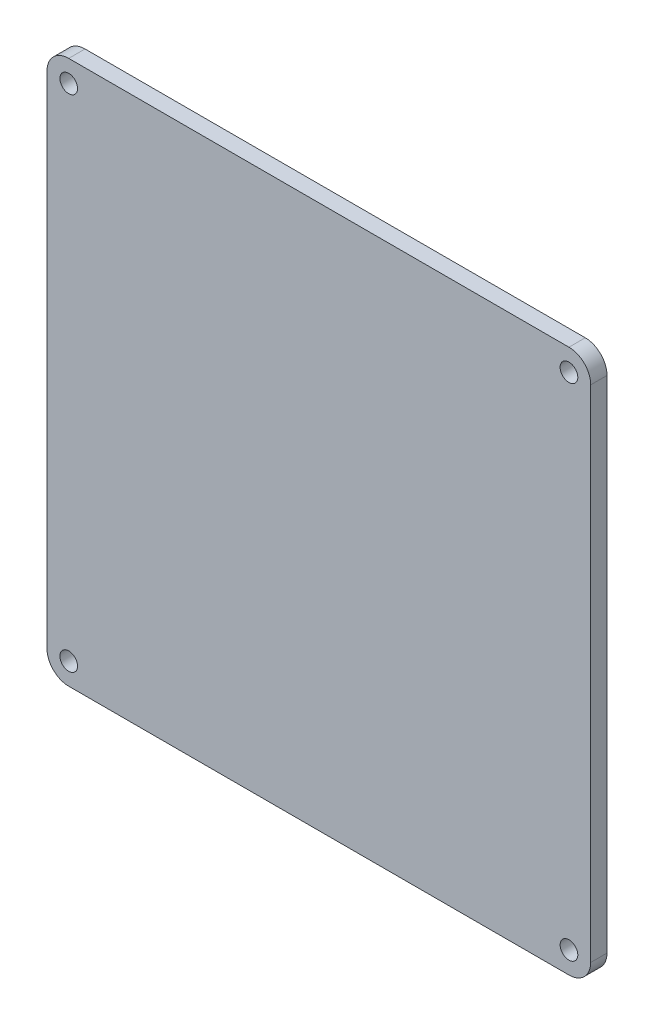
ISO-10303-21;
HEADER;
FILE_DESCRIPTION(('STEP AP214'),'2;1');
FILE_NAME('part.step','',(''),(''),'','','');
FILE_SCHEMA(('AUTOMOTIVE_DESIGN { 1 0 10303 214 1 1 1 1 }'));
ENDSEC;
DATA;
#1=APPLICATION_CONTEXT('core data for automotive mechanical design processes');
#2=APPLICATION_PROTOCOL_DEFINITION('international standard','automotive_design',2000,#1);
#3=PRODUCT_CONTEXT('',#1,'mechanical');
#4=PRODUCT('Part','Part','',(#3));
#5=PRODUCT_RELATED_PRODUCT_CATEGORY('part','',(#4));
#6=PRODUCT_DEFINITION_FORMATION('','',#4);
#7=PRODUCT_DEFINITION_CONTEXT('part definition',#1,'design');
#8=PRODUCT_DEFINITION('design','',#6,#7);
#9=PRODUCT_DEFINITION_SHAPE('','',#8);
#10=(LENGTH_UNIT() NAMED_UNIT(*) SI_UNIT(.MILLI.,.METRE.));
#11=(NAMED_UNIT(*) PLANE_ANGLE_UNIT() SI_UNIT($,.RADIAN.));
#12=(NAMED_UNIT(*) SI_UNIT($,.STERADIAN.) SOLID_ANGLE_UNIT());
#13=UNCERTAINTY_MEASURE_WITH_UNIT(LENGTH_MEASURE(1.E-05),#10,'distance_accuracy_value','');
#14=(GEOMETRIC_REPRESENTATION_CONTEXT(3) GLOBAL_UNCERTAINTY_ASSIGNED_CONTEXT((#13)) GLOBAL_UNIT_ASSIGNED_CONTEXT((#10,
#11,#12)) REPRESENTATION_CONTEXT('',''));
#15=CARTESIAN_POINT('',(0.,0.,0.));
#16=DIRECTION('',(0.,0.,1.));
#17=DIRECTION('',(1.,0.,0.));
#18=AXIS2_PLACEMENT_3D('',#15,#16,#17);
#19=CARTESIAN_POINT('',(-47.7203647416413,-36.6021717055512,3.));
#20=DIRECTION('',(1.,0.,0.));
#21=DIRECTION('',(0.,0.,-1.));
#22=AXIS2_PLACEMENT_3D('',#19,#20,#21);
#23=PLANE('',#22);
#24=DIRECTION('',(0.,-1.,0.));
#25=VECTOR('',#24,1.);
#26=CARTESIAN_POINT('',(-47.7203647416413,-36.6021717055512,3.));
#27=LINE('',#26,#25);
#28=CARTESIAN_POINT('',(-47.7203647416413,59.3978282944488,3.));
#29=VERTEX_POINT('',#28);
#30=CARTESIAN_POINT('',(-47.7203647416413,-32.6021717055512,3.));
#31=VERTEX_POINT('',#30);
#32=EDGE_CURVE('E127',#29,#31,#27,.T.);
#33=ORIENTED_EDGE('',*,*,#32,.F.);
#34=DIRECTION('',(0.,0.,-1.));
#35=VECTOR('',#34,1.);
#36=CARTESIAN_POINT('',(-47.7203647416413,59.3978282944488,3.));
#37=LINE('',#36,#35);
#38=CARTESIAN_POINT('',(-47.7203647416413,59.3978282944488,0.));
#39=VERTEX_POINT('',#38);
#40=EDGE_CURVE('E11',#29,#39,#37,.T.);
#41=ORIENTED_EDGE('',*,*,#40,.T.);
#42=DIRECTION('',(0.,-1.,0.));
#43=VECTOR('',#42,1.);
#44=CARTESIAN_POINT('',(-47.7203647416413,-36.6021717055512,0.));
#45=LINE('',#44,#43);
#46=CARTESIAN_POINT('',(-47.7203647416413,-32.6021717055512,0.));
#47=VERTEX_POINT('',#46);
#48=EDGE_CURVE('E129',#39,#47,#45,.T.);
#49=ORIENTED_EDGE('',*,*,#48,.T.);
#50=DIRECTION('',(0.,0.,-1.));
#51=VECTOR('',#50,1.);
#52=CARTESIAN_POINT('',(-47.7203647416413,-32.6021717055512,3.));
#53=LINE('',#52,#51);
#54=EDGE_CURVE('E40',#47,#31,#53,.F.);
#55=ORIENTED_EDGE('',*,*,#54,.T.);
#56=EDGE_LOOP('',(#33,#41,#49,#55));
#57=FACE_BOUND('',#56,.T.);
#58=ADVANCED_FACE('F32',(#57),#23,.F.);
#59=CARTESIAN_POINT('',(52.2796352583587,-36.6021717055512,3.));
#60=DIRECTION('',(0.,1.,0.));
#61=DIRECTION('',(-1.,0.,0.));
#62=AXIS2_PLACEMENT_3D('',#59,#60,#61);
#63=PLANE('',#62);
#64=DIRECTION('',(1.,0.,0.));
#65=VECTOR('',#64,1.);
#66=CARTESIAN_POINT('',(52.2796352583587,-36.6021717055512,0.));
#67=LINE('',#66,#65);
#68=CARTESIAN_POINT('',(-43.7203647416413,-36.6021717055512,0.));
#69=VERTEX_POINT('',#68);
#70=CARTESIAN_POINT('',(48.2796352583587,-36.6021717055512,0.));
#71=VERTEX_POINT('',#70);
#72=EDGE_CURVE('E125',#69,#71,#67,.T.);
#73=ORIENTED_EDGE('',*,*,#72,.T.);
#74=DIRECTION('',(0.,0.,-1.));
#75=VECTOR('',#74,1.);
#76=CARTESIAN_POINT('',(48.2796352583587,-36.6021717055512,3.));
#77=LINE('',#76,#75);
#78=CARTESIAN_POINT('',(48.2796352583587,-36.6021717055512,3.));
#79=VERTEX_POINT('',#78);
#80=EDGE_CURVE('E104',#71,#79,#77,.F.);
#81=ORIENTED_EDGE('',*,*,#80,.T.);
#82=DIRECTION('',(1.,0.,0.));
#83=VECTOR('',#82,1.);
#84=CARTESIAN_POINT('',(52.2796352583587,-36.6021717055512,3.));
#85=LINE('',#84,#83);
#86=CARTESIAN_POINT('',(-43.7203647416413,-36.6021717055512,3.));
#87=VERTEX_POINT('',#86);
#88=EDGE_CURVE('E165',#87,#79,#85,.T.);
#89=ORIENTED_EDGE('',*,*,#88,.F.);
#90=DIRECTION('',(0.,0.,-1.));
#91=VECTOR('',#90,1.);
#92=CARTESIAN_POINT('',(-43.7203647416413,-36.6021717055512,3.));
#93=LINE('',#92,#91);
#94=EDGE_CURVE('E109',#87,#69,#93,.T.);
#95=ORIENTED_EDGE('',*,*,#94,.T.);
#96=EDGE_LOOP('',(#73,#81,#89,#95));
#97=FACE_BOUND('',#96,.T.);
#98=ADVANCED_FACE('F169',(#97),#63,.F.);
#99=CARTESIAN_POINT('',(52.2796352583587,-36.6021717055512,3.));
#100=DIRECTION('',(-1.,0.,0.));
#101=DIRECTION('',(0.,0.,1.));
#102=AXIS2_PLACEMENT_3D('',#99,#100,#101);
#103=PLANE('',#102);
#104=DIRECTION('',(0.,1.,0.));
#105=VECTOR('',#104,1.);
#106=CARTESIAN_POINT('',(52.2796352583587,-36.6021717055512,3.));
#107=LINE('',#106,#105);
#108=CARTESIAN_POINT('',(52.2796352583587,-32.6021717055512,3.));
#109=VERTEX_POINT('',#108);
#110=CARTESIAN_POINT('',(52.2796352583587,59.3978282944488,3.));
#111=VERTEX_POINT('',#110);
#112=EDGE_CURVE('E118',#109,#111,#107,.T.);
#113=ORIENTED_EDGE('',*,*,#112,.F.);
#114=DIRECTION('',(0.,0.,-1.));
#115=VECTOR('',#114,1.);
#116=CARTESIAN_POINT('',(52.2796352583587,-32.6021717055512,3.));
#117=LINE('',#116,#115);
#118=CARTESIAN_POINT('',(52.2796352583587,-32.6021717055512,0.));
#119=VERTEX_POINT('',#118);
#120=EDGE_CURVE('E103',#109,#119,#117,.T.);
#121=ORIENTED_EDGE('',*,*,#120,.T.);
#122=DIRECTION('',(0.,1.,0.));
#123=VECTOR('',#122,1.);
#124=CARTESIAN_POINT('',(52.2796352583587,-36.6021717055512,0.));
#125=LINE('',#124,#123);
#126=CARTESIAN_POINT('',(52.2796352583587,59.3978282944488,0.));
#127=VERTEX_POINT('',#126);
#128=EDGE_CURVE('E116',#119,#127,#125,.T.);
#129=ORIENTED_EDGE('',*,*,#128,.T.);
#130=DIRECTION('',(0.,0.,-1.));
#131=VECTOR('',#130,1.);
#132=CARTESIAN_POINT('',(52.2796352583587,59.3978282944488,3.));
#133=LINE('',#132,#131);
#134=EDGE_CURVE('E120',#127,#111,#133,.F.);
#135=ORIENTED_EDGE('',*,*,#134,.T.);
#136=EDGE_LOOP('',(#113,#121,#129,#135));
#137=FACE_BOUND('',#136,.T.);
#138=ADVANCED_FACE('F115',(#137),#103,.F.);
#139=CARTESIAN_POINT('',(52.2796352583587,63.3978282944488,3.));
#140=DIRECTION('',(0.,-1.,0.));
#141=DIRECTION('',(0.,0.,-1.));
#142=AXIS2_PLACEMENT_3D('',#139,#140,#141);
#143=PLANE('',#142);
#144=DIRECTION('',(-1.,0.,0.));
#145=VECTOR('',#144,1.);
#146=CARTESIAN_POINT('',(52.2796352583587,63.3978282944488,3.));
#147=LINE('',#146,#145);
#148=CARTESIAN_POINT('',(48.2796352583587,63.3978282944488,3.));
#149=VERTEX_POINT('',#148);
#150=CARTESIAN_POINT('',(-43.7203647416413,63.3978282944488,3.));
#151=VERTEX_POINT('',#150);
#152=EDGE_CURVE('E133',#149,#151,#147,.T.);
#153=ORIENTED_EDGE('',*,*,#152,.F.);
#154=DIRECTION('',(0.,0.,-1.));
#155=VECTOR('',#154,1.);
#156=CARTESIAN_POINT('',(48.2796352583587,63.3978282944488,3.));
#157=LINE('',#156,#155);
#158=CARTESIAN_POINT('',(48.2796352583587,63.3978282944488,0.));
#159=VERTEX_POINT('',#158);
#160=EDGE_CURVE('E150',#149,#159,#157,.T.);
#161=ORIENTED_EDGE('',*,*,#160,.T.);
#162=DIRECTION('',(-1.,0.,0.));
#163=VECTOR('',#162,1.);
#164=CARTESIAN_POINT('',(52.2796352583587,63.3978282944488,0.));
#165=LINE('',#164,#163);
#166=CARTESIAN_POINT('',(-43.7203647416413,63.3978282944488,0.));
#167=VERTEX_POINT('',#166);
#168=EDGE_CURVE('E124',#159,#167,#165,.T.);
#169=ORIENTED_EDGE('',*,*,#168,.T.);
#170=DIRECTION('',(0.,0.,-1.));
#171=VECTOR('',#170,1.);
#172=CARTESIAN_POINT('',(-43.7203647416413,63.3978282944488,3.));
#173=LINE('',#172,#171);
#174=EDGE_CURVE('E47',#167,#151,#173,.F.);
#175=ORIENTED_EDGE('',*,*,#174,.T.);
#176=EDGE_LOOP('',(#153,#161,#169,#175));
#177=FACE_BOUND('',#176,.T.);
#178=ADVANCED_FACE('F264',(#177),#143,.F.);
#179=CARTESIAN_POINT('',(0.,0.,3.));
#180=DIRECTION('',(0.,0.,1.));
#181=DIRECTION('',(1.,0.,0.));
#182=AXIS2_PLACEMENT_3D('',#179,#180,#181);
#183=PLANE('',#182);
#184=CARTESIAN_POINT('',(-43.7203647416413,59.3978282944488,3.));
#185=DIRECTION('',(0.,0.,-1.));
#186=DIRECTION('',(-1.,0.,0.));
#187=AXIS2_PLACEMENT_3D('',#184,#185,#186);
#188=CIRCLE('',#187,1.625);
#189=CARTESIAN_POINT('',(-45.3453647416413,59.3978282944488,3.));
#190=VERTEX_POINT('',#189);
#191=EDGE_CURVE('E179',#190,#190,#188,.T.);
#192=ORIENTED_EDGE('',*,*,#191,.T.);
#193=EDGE_LOOP('',(#192));
#194=FACE_BOUND('',#193,.T.);
#195=CARTESIAN_POINT('',(-43.7203647416413,-32.6021717055512,3.));
#196=DIRECTION('',(0.,0.,-1.));
#197=DIRECTION('',(-1.,0.,0.));
#198=AXIS2_PLACEMENT_3D('',#195,#196,#197);
#199=CIRCLE('',#198,1.625);
#200=CARTESIAN_POINT('',(-45.3453647416413,-32.6021717055512,3.));
#201=VERTEX_POINT('',#200);
#202=EDGE_CURVE('E190',#201,#201,#199,.T.);
#203=ORIENTED_EDGE('',*,*,#202,.T.);
#204=EDGE_LOOP('',(#203));
#205=FACE_BOUND('',#204,.T.);
#206=CARTESIAN_POINT('',(48.2796352583587,-32.6021717055512,3.));
#207=DIRECTION('',(0.,0.,-1.));
#208=DIRECTION('',(-1.,0.,0.));
#209=AXIS2_PLACEMENT_3D('',#206,#207,#208);
#210=CIRCLE('',#209,1.625);
#211=CARTESIAN_POINT('',(46.6546352583587,-32.6021717055512,3.));
#212=VERTEX_POINT('',#211);
#213=EDGE_CURVE('E184',#212,#212,#210,.T.);
#214=ORIENTED_EDGE('',*,*,#213,.T.);
#215=EDGE_LOOP('',(#214));
#216=FACE_BOUND('',#215,.T.);
#217=CARTESIAN_POINT('',(48.2796352583587,59.3978282944488,3.));
#218=DIRECTION('',(0.,0.,-1.));
#219=DIRECTION('',(-1.,0.,0.));
#220=AXIS2_PLACEMENT_3D('',#217,#218,#219);
#221=CIRCLE('',#220,1.625);
#222=CARTESIAN_POINT('',(46.6546352583587,59.3978282944488,3.));
#223=VERTEX_POINT('',#222);
#224=EDGE_CURVE('E170',#223,#223,#221,.T.);
#225=ORIENTED_EDGE('',*,*,#224,.T.);
#226=EDGE_LOOP('',(#225));
#227=FACE_BOUND('',#226,.T.);
#228=ORIENTED_EDGE('',*,*,#88,.T.);
#229=CARTESIAN_POINT('',(48.2796352583587,-32.6021717055512,3.));
#230=DIRECTION('',(0.,0.,1.));
#231=DIRECTION('',(1.,0.,0.));
#232=AXIS2_PLACEMENT_3D('',#229,#230,#231);
#233=CIRCLE('',#232,4.);
#234=EDGE_CURVE('E147',#79,#109,#233,.T.);
#235=ORIENTED_EDGE('',*,*,#234,.T.);
#236=ORIENTED_EDGE('',*,*,#112,.T.);
#237=CARTESIAN_POINT('',(48.2796352583587,59.3978282944488,3.));
#238=DIRECTION('',(0.,0.,1.));
#239=DIRECTION('',(1.,0.,0.));
#240=AXIS2_PLACEMENT_3D('',#237,#238,#239);
#241=CIRCLE('',#240,4.);
#242=EDGE_CURVE('E54',#111,#149,#241,.T.);
#243=ORIENTED_EDGE('',*,*,#242,.T.);
#244=ORIENTED_EDGE('',*,*,#152,.T.);
#245=CARTESIAN_POINT('',(-43.7203647416413,59.3978282944488,3.));
#246=DIRECTION('',(0.,0.,1.));
#247=DIRECTION('',(1.,0.,0.));
#248=AXIS2_PLACEMENT_3D('',#245,#246,#247);
#249=CIRCLE('',#248,4.);
#250=EDGE_CURVE('E144',#151,#29,#249,.T.);
#251=ORIENTED_EDGE('',*,*,#250,.T.);
#252=ORIENTED_EDGE('',*,*,#32,.T.);
#253=CARTESIAN_POINT('',(-43.7203647416413,-32.6021717055512,3.));
#254=DIRECTION('',(0.,0.,1.));
#255=DIRECTION('',(1.,0.,0.));
#256=AXIS2_PLACEMENT_3D('',#253,#254,#255);
#257=CIRCLE('',#256,4.);
#258=EDGE_CURVE('E142',#31,#87,#257,.T.);
#259=ORIENTED_EDGE('',*,*,#258,.T.);
#260=EDGE_LOOP('',(#228,#235,#236,#243,#244,#251,#252,#259));
#261=FACE_BOUND('',#260,.T.);
#262=ADVANCED_FACE('F162',(#194,#205,#216,#227,#261),#183,.T.);
#263=CARTESIAN_POINT('',(0.,0.,0.));
#264=DIRECTION('',(0.,0.,1.));
#265=DIRECTION('',(1.,0.,0.));
#266=AXIS2_PLACEMENT_3D('',#263,#264,#265);
#267=PLANE('',#266);
#268=CARTESIAN_POINT('',(-43.7203647416413,59.3978282944488,0.));
#269=DIRECTION('',(0.,0.,-1.));
#270=DIRECTION('',(-1.,0.,0.));
#271=AXIS2_PLACEMENT_3D('',#268,#269,#270);
#272=CIRCLE('',#271,1.625);
#273=CARTESIAN_POINT('',(-45.3453647416413,59.3978282944488,0.));
#274=VERTEX_POINT('',#273);
#275=EDGE_CURVE('E193',#274,#274,#272,.T.);
#276=ORIENTED_EDGE('',*,*,#275,.F.);
#277=EDGE_LOOP('',(#276));
#278=FACE_BOUND('',#277,.T.);
#279=CARTESIAN_POINT('',(-43.7203647416413,-32.6021717055512,0.));
#280=DIRECTION('',(0.,0.,-1.));
#281=DIRECTION('',(-1.,0.,0.));
#282=AXIS2_PLACEMENT_3D('',#279,#280,#281);
#283=CIRCLE('',#282,1.625);
#284=CARTESIAN_POINT('',(-45.3453647416413,-32.6021717055512,0.));
#285=VERTEX_POINT('',#284);
#286=EDGE_CURVE('E187',#285,#285,#283,.T.);
#287=ORIENTED_EDGE('',*,*,#286,.F.);
#288=EDGE_LOOP('',(#287));
#289=FACE_BOUND('',#288,.T.);
#290=CARTESIAN_POINT('',(48.2796352583587,-32.6021717055512,0.));
#291=DIRECTION('',(0.,0.,-1.));
#292=DIRECTION('',(-1.,0.,0.));
#293=AXIS2_PLACEMENT_3D('',#290,#291,#292);
#294=CIRCLE('',#293,1.625);
#295=CARTESIAN_POINT('',(46.6546352583587,-32.6021717055512,0.));
#296=VERTEX_POINT('',#295);
#297=EDGE_CURVE('E181',#296,#296,#294,.T.);
#298=ORIENTED_EDGE('',*,*,#297,.F.);
#299=EDGE_LOOP('',(#298));
#300=FACE_BOUND('',#299,.T.);
#301=CARTESIAN_POINT('',(48.2796352583587,59.3978282944488,0.));
#302=DIRECTION('',(0.,0.,-1.));
#303=DIRECTION('',(-1.,0.,0.));
#304=AXIS2_PLACEMENT_3D('',#301,#302,#303);
#305=CIRCLE('',#304,1.625);
#306=CARTESIAN_POINT('',(46.6546352583587,59.3978282944488,0.));
#307=VERTEX_POINT('',#306);
#308=EDGE_CURVE('E172',#307,#307,#305,.T.);
#309=ORIENTED_EDGE('',*,*,#308,.F.);
#310=EDGE_LOOP('',(#309));
#311=FACE_BOUND('',#310,.T.);
#312=ORIENTED_EDGE('',*,*,#128,.F.);
#313=CARTESIAN_POINT('',(48.2796352583587,-32.6021717055512,0.));
#314=DIRECTION('',(0.,0.,1.));
#315=DIRECTION('',(1.,0.,0.));
#316=AXIS2_PLACEMENT_3D('',#313,#314,#315);
#317=CIRCLE('',#316,4.);
#318=EDGE_CURVE('E99',#119,#71,#317,.F.);
#319=ORIENTED_EDGE('',*,*,#318,.T.);
#320=ORIENTED_EDGE('',*,*,#72,.F.);
#321=CARTESIAN_POINT('',(-43.7203647416413,-32.6021717055512,0.));
#322=DIRECTION('',(0.,0.,1.));
#323=DIRECTION('',(1.,0.,0.));
#324=AXIS2_PLACEMENT_3D('',#321,#322,#323);
#325=CIRCLE('',#324,4.);
#326=EDGE_CURVE('E119',#69,#47,#325,.F.);
#327=ORIENTED_EDGE('',*,*,#326,.T.);
#328=ORIENTED_EDGE('',*,*,#48,.F.);
#329=CARTESIAN_POINT('',(-43.7203647416413,59.3978282944488,0.));
#330=DIRECTION('',(0.,0.,1.));
#331=DIRECTION('',(1.,0.,0.));
#332=AXIS2_PLACEMENT_3D('',#329,#330,#331);
#333=CIRCLE('',#332,4.);
#334=EDGE_CURVE('E136',#39,#167,#333,.F.);
#335=ORIENTED_EDGE('',*,*,#334,.T.);
#336=ORIENTED_EDGE('',*,*,#168,.F.);
#337=CARTESIAN_POINT('',(48.2796352583587,59.3978282944488,0.));
#338=DIRECTION('',(0.,0.,1.));
#339=DIRECTION('',(1.,0.,0.));
#340=AXIS2_PLACEMENT_3D('',#337,#338,#339);
#341=CIRCLE('',#340,4.);
#342=EDGE_CURVE('E110',#159,#127,#341,.F.);
#343=ORIENTED_EDGE('',*,*,#342,.T.);
#344=EDGE_LOOP('',(#312,#319,#320,#327,#328,#335,#336,#343));
#345=FACE_BOUND('',#344,.T.);
#346=ADVANCED_FACE('F122',(#278,#289,#300,#311,#345),#267,.F.);
#347=CARTESIAN_POINT('',(48.2796352583587,-32.6021717055512,3.));
#348=DIRECTION('',(0.,0.,-1.));
#349=DIRECTION('',(-1.,0.,0.));
#350=AXIS2_PLACEMENT_3D('',#347,#348,#349);
#351=CYLINDRICAL_SURFACE('',#350,4.);
#352=ORIENTED_EDGE('',*,*,#234,.F.);
#353=ORIENTED_EDGE('',*,*,#80,.F.);
#354=ORIENTED_EDGE('',*,*,#318,.F.);
#355=ORIENTED_EDGE('',*,*,#120,.F.);
#356=EDGE_LOOP('',(#352,#353,#354,#355));
#357=FACE_BOUND('',#356,.T.);
#358=ADVANCED_FACE('F102',(#357),#351,.T.);
#359=CARTESIAN_POINT('',(48.2796352583587,59.3978282944488,3.));
#360=DIRECTION('',(0.,0.,-1.));
#361=DIRECTION('',(-1.,0.,0.));
#362=AXIS2_PLACEMENT_3D('',#359,#360,#361);
#363=CYLINDRICAL_SURFACE('',#362,4.);
#364=ORIENTED_EDGE('',*,*,#242,.F.);
#365=ORIENTED_EDGE('',*,*,#134,.F.);
#366=ORIENTED_EDGE('',*,*,#342,.F.);
#367=ORIENTED_EDGE('',*,*,#160,.F.);
#368=EDGE_LOOP('',(#364,#365,#366,#367));
#369=FACE_BOUND('',#368,.T.);
#370=ADVANCED_FACE('F241',(#369),#363,.T.);
#371=CARTESIAN_POINT('',(-43.7203647416413,59.3978282944488,3.));
#372=DIRECTION('',(0.,0.,-1.));
#373=DIRECTION('',(-1.,0.,0.));
#374=AXIS2_PLACEMENT_3D('',#371,#372,#373);
#375=CYLINDRICAL_SURFACE('',#374,4.);
#376=ORIENTED_EDGE('',*,*,#250,.F.);
#377=ORIENTED_EDGE('',*,*,#174,.F.);
#378=ORIENTED_EDGE('',*,*,#334,.F.);
#379=ORIENTED_EDGE('',*,*,#40,.F.);
#380=EDGE_LOOP('',(#376,#377,#378,#379));
#381=FACE_BOUND('',#380,.T.);
#382=ADVANCED_FACE('F228',(#381),#375,.T.);
#383=CARTESIAN_POINT('',(-43.7203647416413,-32.6021717055512,3.));
#384=DIRECTION('',(0.,0.,-1.));
#385=DIRECTION('',(-1.,0.,0.));
#386=AXIS2_PLACEMENT_3D('',#383,#384,#385);
#387=CYLINDRICAL_SURFACE('',#386,4.);
#388=ORIENTED_EDGE('',*,*,#258,.F.);
#389=ORIENTED_EDGE('',*,*,#54,.F.);
#390=ORIENTED_EDGE('',*,*,#326,.F.);
#391=ORIENTED_EDGE('',*,*,#94,.F.);
#392=EDGE_LOOP('',(#388,#389,#390,#391));
#393=FACE_BOUND('',#392,.T.);
#394=ADVANCED_FACE('F34',(#393),#387,.T.);
#395=CARTESIAN_POINT('',(48.2796352583587,59.3978282944488,3.));
#396=DIRECTION('',(0.,0.,-1.));
#397=DIRECTION('',(-1.,0.,0.));
#398=AXIS2_PLACEMENT_3D('',#395,#396,#397);
#399=CYLINDRICAL_SURFACE('',#398,1.625);
#400=ORIENTED_EDGE('',*,*,#224,.F.);
#401=EDGE_LOOP('',(#400));
#402=FACE_BOUND('',#401,.T.);
#403=ORIENTED_EDGE('',*,*,#308,.T.);
#404=EDGE_LOOP('',(#403));
#405=FACE_BOUND('',#404,.T.);
#406=ADVANCED_FACE('F217',(#402,#405),#399,.F.);
#407=CARTESIAN_POINT('',(48.2796352583587,-32.6021717055512,3.));
#408=DIRECTION('',(0.,0.,-1.));
#409=DIRECTION('',(-1.,0.,0.));
#410=AXIS2_PLACEMENT_3D('',#407,#408,#409);
#411=CYLINDRICAL_SURFACE('',#410,1.625);
#412=ORIENTED_EDGE('',*,*,#213,.F.);
#413=EDGE_LOOP('',(#412));
#414=FACE_BOUND('',#413,.T.);
#415=ORIENTED_EDGE('',*,*,#297,.T.);
#416=EDGE_LOOP('',(#415));
#417=FACE_BOUND('',#416,.T.);
#418=ADVANCED_FACE('F219',(#414,#417),#411,.F.);
#419=CARTESIAN_POINT('',(-43.7203647416413,-32.6021717055512,3.));
#420=DIRECTION('',(0.,0.,-1.));
#421=DIRECTION('',(-1.,0.,0.));
#422=AXIS2_PLACEMENT_3D('',#419,#420,#421);
#423=CYLINDRICAL_SURFACE('',#422,1.625);
#424=ORIENTED_EDGE('',*,*,#202,.F.);
#425=EDGE_LOOP('',(#424));
#426=FACE_BOUND('',#425,.T.);
#427=ORIENTED_EDGE('',*,*,#286,.T.);
#428=EDGE_LOOP('',(#427));
#429=FACE_BOUND('',#428,.T.);
#430=ADVANCED_FACE('F204',(#426,#429),#423,.F.);
#431=CARTESIAN_POINT('',(-43.7203647416413,59.3978282944488,3.));
#432=DIRECTION('',(0.,0.,-1.));
#433=DIRECTION('',(-1.,0.,0.));
#434=AXIS2_PLACEMENT_3D('',#431,#432,#433);
#435=CYLINDRICAL_SURFACE('',#434,1.625);
#436=ORIENTED_EDGE('',*,*,#191,.F.);
#437=EDGE_LOOP('',(#436));
#438=FACE_BOUND('',#437,.T.);
#439=ORIENTED_EDGE('',*,*,#275,.T.);
#440=EDGE_LOOP('',(#439));
#441=FACE_BOUND('',#440,.T.);
#442=ADVANCED_FACE('F201',(#438,#441),#435,.F.);
#443=CLOSED_SHELL('',(#58,#98,#138,#178,#262,#346,#358,#370,#382,#394,#406,#418,#430,#442));
#444=MANIFOLD_SOLID_BREP('B2',#443);
#445=ADVANCED_BREP_SHAPE_REPRESENTATION('',(#18,#444),#14);
#446=SHAPE_DEFINITION_REPRESENTATION(#9,#445);
ENDSEC;
END-ISO-10303-21;
